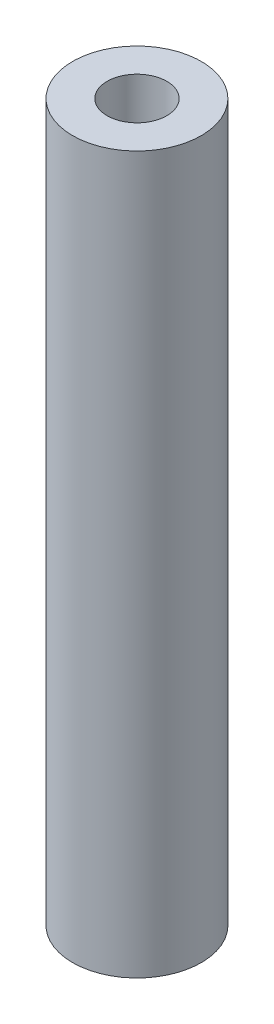
ISO-10303-21;
HEADER;
FILE_DESCRIPTION(('STEP AP214'),'2;1');
FILE_NAME('part.step','',(''),(''),'','','');
FILE_SCHEMA(('AUTOMOTIVE_DESIGN { 1 0 10303 214 1 1 1 1 }'));
ENDSEC;
DATA;
#1=APPLICATION_CONTEXT('core data for automotive mechanical design processes');
#2=APPLICATION_PROTOCOL_DEFINITION('international standard','automotive_design',2000,#1);
#3=PRODUCT_CONTEXT('',#1,'mechanical');
#4=PRODUCT('Part','Part','',(#3));
#5=PRODUCT_RELATED_PRODUCT_CATEGORY('part','',(#4));
#6=PRODUCT_DEFINITION_FORMATION('','',#4);
#7=PRODUCT_DEFINITION_CONTEXT('part definition',#1,'design');
#8=PRODUCT_DEFINITION('design','',#6,#7);
#9=PRODUCT_DEFINITION_SHAPE('','',#8);
#10=(LENGTH_UNIT() NAMED_UNIT(*) SI_UNIT(.MILLI.,.METRE.));
#11=(NAMED_UNIT(*) PLANE_ANGLE_UNIT() SI_UNIT($,.RADIAN.));
#12=(NAMED_UNIT(*) SI_UNIT($,.STERADIAN.) SOLID_ANGLE_UNIT());
#13=UNCERTAINTY_MEASURE_WITH_UNIT(LENGTH_MEASURE(1.E-05),#10,'distance_accuracy_value','');
#14=(GEOMETRIC_REPRESENTATION_CONTEXT(3) GLOBAL_UNCERTAINTY_ASSIGNED_CONTEXT((#13)) GLOBAL_UNIT_ASSIGNED_CONTEXT((#10,
#11,#12)) REPRESENTATION_CONTEXT('',''));
#15=CARTESIAN_POINT('',(0.,0.,0.));
#16=DIRECTION('',(0.,0.,1.));
#17=DIRECTION('',(1.,0.,0.));
#18=AXIS2_PLACEMENT_3D('',#15,#16,#17);
#19=CARTESIAN_POINT('',(0.,27.,0.));
#20=DIRECTION('',(0.,1.,0.));
#21=DIRECTION('',(0.,0.,1.));
#22=AXIS2_PLACEMENT_3D('',#19,#20,#21);
#23=PLANE('',#22);
#24=CARTESIAN_POINT('',(0.,27.,0.));
#25=DIRECTION('',(0.,1.,0.));
#26=DIRECTION('',(0.,0.,1.));
#27=AXIS2_PLACEMENT_3D('',#24,#25,#26);
#28=CIRCLE('',#27,2.425);
#29=CARTESIAN_POINT('',(0.,27.,2.425));
#30=VERTEX_POINT('',#29);
#31=EDGE_CURVE('E10',#30,#30,#28,.T.);
#32=ORIENTED_EDGE('',*,*,#31,.T.);
#33=EDGE_LOOP('',(#32));
#34=FACE_BOUND('',#33,.T.);
#35=CARTESIAN_POINT('',(0.,27.,0.));
#36=DIRECTION('',(0.,1.,0.));
#37=DIRECTION('',(0.,0.,1.));
#38=AXIS2_PLACEMENT_3D('',#35,#36,#37);
#39=CIRCLE('',#38,1.125);
#40=CARTESIAN_POINT('',(0.,27.,1.125));
#41=VERTEX_POINT('',#40);
#42=EDGE_CURVE('E40',#41,#41,#39,.T.);
#43=ORIENTED_EDGE('',*,*,#42,.F.);
#44=EDGE_LOOP('',(#43));
#45=FACE_BOUND('',#44,.T.);
#46=ADVANCED_FACE('F29',(#34,#45),#23,.T.);
#47=CARTESIAN_POINT('',(0.,0.,0.));
#48=DIRECTION('',(0.,1.,0.));
#49=DIRECTION('',(0.,0.,1.));
#50=AXIS2_PLACEMENT_3D('',#47,#48,#49);
#51=PLANE('',#50);
#52=CARTESIAN_POINT('',(0.,0.,0.));
#53=DIRECTION('',(0.,1.,0.));
#54=DIRECTION('',(0.,0.,1.));
#55=AXIS2_PLACEMENT_3D('',#52,#53,#54);
#56=CIRCLE('',#55,2.425);
#57=CARTESIAN_POINT('',(0.,0.,2.425));
#58=VERTEX_POINT('',#57);
#59=EDGE_CURVE('E33',#58,#58,#56,.T.);
#60=ORIENTED_EDGE('',*,*,#59,.F.);
#61=EDGE_LOOP('',(#60));
#62=FACE_BOUND('',#61,.T.);
#63=CARTESIAN_POINT('',(0.,0.,0.));
#64=DIRECTION('',(0.,1.,0.));
#65=DIRECTION('',(0.,0.,1.));
#66=AXIS2_PLACEMENT_3D('',#63,#64,#65);
#67=CIRCLE('',#66,1.125);
#68=CARTESIAN_POINT('',(0.,0.,1.125));
#69=VERTEX_POINT('',#68);
#70=EDGE_CURVE('E42',#69,#69,#67,.T.);
#71=ORIENTED_EDGE('',*,*,#70,.T.);
#72=EDGE_LOOP('',(#71));
#73=FACE_BOUND('',#72,.T.);
#74=ADVANCED_FACE('F52',(#62,#73),#51,.F.);
#75=CARTESIAN_POINT('',(0.,27.,0.));
#76=DIRECTION('',(0.,-1.,0.));
#77=DIRECTION('',(0.,0.,-1.));
#78=AXIS2_PLACEMENT_3D('',#75,#76,#77);
#79=CYLINDRICAL_SURFACE('',#78,2.425);
#80=ORIENTED_EDGE('',*,*,#31,.F.);
#81=EDGE_LOOP('',(#80));
#82=FACE_BOUND('',#81,.T.);
#83=ORIENTED_EDGE('',*,*,#59,.T.);
#84=EDGE_LOOP('',(#83));
#85=FACE_BOUND('',#84,.T.);
#86=ADVANCED_FACE('F31',(#82,#85),#79,.T.);
#87=CARTESIAN_POINT('',(0.,27.,0.));
#88=DIRECTION('',(0.,-1.,0.));
#89=DIRECTION('',(0.,0.,-1.));
#90=AXIS2_PLACEMENT_3D('',#87,#88,#89);
#91=CYLINDRICAL_SURFACE('',#90,1.125);
#92=ORIENTED_EDGE('',*,*,#42,.T.);
#93=EDGE_LOOP('',(#92));
#94=FACE_BOUND('',#93,.T.);
#95=ORIENTED_EDGE('',*,*,#70,.F.);
#96=EDGE_LOOP('',(#95));
#97=FACE_BOUND('',#96,.T.);
#98=ADVANCED_FACE('F48',(#94,#97),#91,.F.);
#99=CLOSED_SHELL('',(#46,#74,#86,#98));
#100=MANIFOLD_SOLID_BREP('B2',#99);
#101=ADVANCED_BREP_SHAPE_REPRESENTATION('',(#18,#100),#14);
#102=SHAPE_DEFINITION_REPRESENTATION(#9,#101);
ENDSEC;
END-ISO-10303-21;
